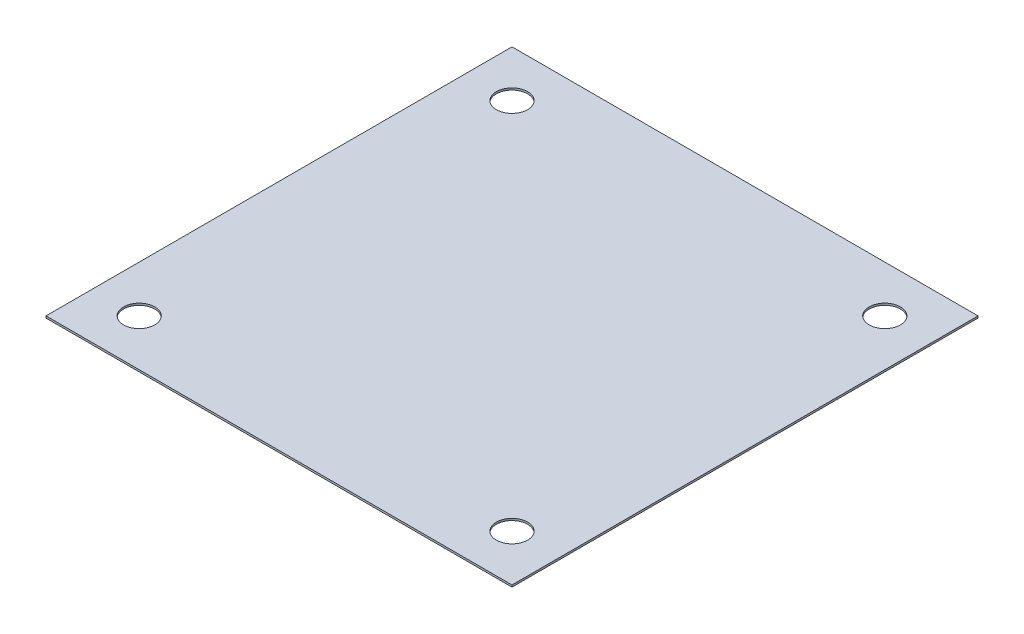
ISO-10303-21;
HEADER;
FILE_DESCRIPTION(('STEP AP214'),'2;1');
FILE_NAME('part.step','',(''),(''),'','','');
FILE_SCHEMA(('AUTOMOTIVE_DESIGN { 1 0 10303 214 1 1 1 1 }'));
ENDSEC;
DATA;
#1=APPLICATION_CONTEXT('core data for automotive mechanical design processes');
#2=APPLICATION_PROTOCOL_DEFINITION('international standard','automotive_design',2000,#1);
#3=PRODUCT_CONTEXT('',#1,'mechanical');
#4=PRODUCT('Part','Part','',(#3));
#5=PRODUCT_RELATED_PRODUCT_CATEGORY('part','',(#4));
#6=PRODUCT_DEFINITION_FORMATION('','',#4);
#7=PRODUCT_DEFINITION_CONTEXT('part definition',#1,'design');
#8=PRODUCT_DEFINITION('design','',#6,#7);
#9=PRODUCT_DEFINITION_SHAPE('','',#8);
#10=(LENGTH_UNIT() NAMED_UNIT(*) SI_UNIT(.MILLI.,.METRE.));
#11=(NAMED_UNIT(*) PLANE_ANGLE_UNIT() SI_UNIT($,.RADIAN.));
#12=(NAMED_UNIT(*) SI_UNIT($,.STERADIAN.) SOLID_ANGLE_UNIT());
#13=UNCERTAINTY_MEASURE_WITH_UNIT(LENGTH_MEASURE(1.E-05),#10,'distance_accuracy_value','');
#14=(GEOMETRIC_REPRESENTATION_CONTEXT(3) GLOBAL_UNCERTAINTY_ASSIGNED_CONTEXT((#13)) GLOBAL_UNIT_ASSIGNED_CONTEXT((#10,
#11,#12)) REPRESENTATION_CONTEXT('',''));
#15=CARTESIAN_POINT('',(0.,0.,0.));
#16=DIRECTION('',(0.,0.,1.));
#17=DIRECTION('',(1.,0.,0.));
#18=AXIS2_PLACEMENT_3D('',#15,#16,#17);
#19=CARTESIAN_POINT('',(-762.,6.35,-762.));
#20=DIRECTION('',(1.,0.,0.));
#21=DIRECTION('',(0.,0.,-1.));
#22=AXIS2_PLACEMENT_3D('',#19,#20,#21);
#23=PLANE('',#22);
#24=DIRECTION('',(0.,0.,1.));
#25=VECTOR('',#24,1.);
#26=CARTESIAN_POINT('',(-762.,0.,-762.));
#27=LINE('',#26,#25);
#28=CARTESIAN_POINT('',(-762.,0.,-762.));
#29=VERTEX_POINT('',#28);
#30=CARTESIAN_POINT('',(-762.,0.,762.));
#31=VERTEX_POINT('',#30);
#32=EDGE_CURVE('E98',#29,#31,#27,.T.);
#33=ORIENTED_EDGE('',*,*,#32,.T.);
#34=DIRECTION('',(0.,-1.,0.));
#35=VECTOR('',#34,1.);
#36=CARTESIAN_POINT('',(-762.,6.35,762.));
#37=LINE('',#36,#35);
#38=CARTESIAN_POINT('',(-762.,6.35,762.));
#39=VERTEX_POINT('',#38);
#40=EDGE_CURVE('E11',#39,#31,#37,.T.);
#41=ORIENTED_EDGE('',*,*,#40,.F.);
#42=DIRECTION('',(0.,0.,1.));
#43=VECTOR('',#42,1.);
#44=CARTESIAN_POINT('',(-762.,6.35,-762.));
#45=LINE('',#44,#43);
#46=CARTESIAN_POINT('',(-762.,6.35,-762.));
#47=VERTEX_POINT('',#46);
#48=EDGE_CURVE('E86',#47,#39,#45,.T.);
#49=ORIENTED_EDGE('',*,*,#48,.F.);
#50=DIRECTION('',(0.,-1.,0.));
#51=VECTOR('',#50,1.);
#52=CARTESIAN_POINT('',(-762.,6.35,-762.));
#53=LINE('',#52,#51);
#54=EDGE_CURVE('E94',#47,#29,#53,.T.);
#55=ORIENTED_EDGE('',*,*,#54,.T.);
#56=EDGE_LOOP('',(#33,#41,#49,#55));
#57=FACE_BOUND('',#56,.T.);
#58=ADVANCED_FACE('F35',(#57),#23,.F.);
#59=CARTESIAN_POINT('',(-762.,6.35,762.));
#60=DIRECTION('',(0.,0.,-1.));
#61=DIRECTION('',(-1.,0.,0.));
#62=AXIS2_PLACEMENT_3D('',#59,#60,#61);
#63=PLANE('',#62);
#64=DIRECTION('',(1.,0.,0.));
#65=VECTOR('',#64,1.);
#66=CARTESIAN_POINT('',(-762.,0.,762.));
#67=LINE('',#66,#65);
#68=CARTESIAN_POINT('',(762.,0.,762.));
#69=VERTEX_POINT('',#68);
#70=EDGE_CURVE('E90',#31,#69,#67,.T.);
#71=ORIENTED_EDGE('',*,*,#70,.T.);
#72=DIRECTION('',(0.,-1.,0.));
#73=VECTOR('',#72,1.);
#74=CARTESIAN_POINT('',(762.,6.35,762.));
#75=LINE('',#74,#73);
#76=CARTESIAN_POINT('',(762.,6.35,762.));
#77=VERTEX_POINT('',#76);
#78=EDGE_CURVE('E43',#77,#69,#75,.T.);
#79=ORIENTED_EDGE('',*,*,#78,.F.);
#80=DIRECTION('',(1.,0.,0.));
#81=VECTOR('',#80,1.);
#82=CARTESIAN_POINT('',(-762.,6.35,762.));
#83=LINE('',#82,#81);
#84=EDGE_CURVE('E81',#39,#77,#83,.T.);
#85=ORIENTED_EDGE('',*,*,#84,.F.);
#86=ORIENTED_EDGE('',*,*,#40,.T.);
#87=EDGE_LOOP('',(#71,#79,#85,#86));
#88=FACE_BOUND('',#87,.T.);
#89=ADVANCED_FACE('F89',(#88),#63,.F.);
#90=CARTESIAN_POINT('',(762.,6.35,-762.));
#91=DIRECTION('',(-1.,0.,0.));
#92=DIRECTION('',(0.,0.,1.));
#93=AXIS2_PLACEMENT_3D('',#90,#91,#92);
#94=PLANE('',#93);
#95=DIRECTION('',(0.,0.,-1.));
#96=VECTOR('',#95,1.);
#97=CARTESIAN_POINT('',(762.,0.,-762.));
#98=LINE('',#97,#96);
#99=CARTESIAN_POINT('',(762.,0.,-762.));
#100=VERTEX_POINT('',#99);
#101=EDGE_CURVE('E68',#69,#100,#98,.T.);
#102=ORIENTED_EDGE('',*,*,#101,.T.);
#103=DIRECTION('',(0.,-1.,0.));
#104=VECTOR('',#103,1.);
#105=CARTESIAN_POINT('',(762.,6.35,-762.));
#106=LINE('',#105,#104);
#107=CARTESIAN_POINT('',(762.,6.35,-762.));
#108=VERTEX_POINT('',#107);
#109=EDGE_CURVE('E91',#108,#100,#106,.T.);
#110=ORIENTED_EDGE('',*,*,#109,.F.);
#111=DIRECTION('',(0.,0.,-1.));
#112=VECTOR('',#111,1.);
#113=CARTESIAN_POINT('',(762.,6.35,-762.));
#114=LINE('',#113,#112);
#115=EDGE_CURVE('E84',#77,#108,#114,.T.);
#116=ORIENTED_EDGE('',*,*,#115,.F.);
#117=ORIENTED_EDGE('',*,*,#78,.T.);
#118=EDGE_LOOP('',(#102,#110,#116,#117));
#119=FACE_BOUND('',#118,.T.);
#120=ADVANCED_FACE('F92',(#119),#94,.F.);
#121=CARTESIAN_POINT('',(-762.,6.35,-762.));
#122=DIRECTION('',(0.,0.,1.));
#123=DIRECTION('',(1.,0.,0.));
#124=AXIS2_PLACEMENT_3D('',#121,#122,#123);
#125=PLANE('',#124);
#126=DIRECTION('',(-1.,0.,0.));
#127=VECTOR('',#126,1.);
#128=CARTESIAN_POINT('',(-762.,0.,-762.));
#129=LINE('',#128,#127);
#130=EDGE_CURVE('E74',#100,#29,#129,.T.);
#131=ORIENTED_EDGE('',*,*,#130,.T.);
#132=ORIENTED_EDGE('',*,*,#54,.F.);
#133=DIRECTION('',(-1.,0.,0.));
#134=VECTOR('',#133,1.);
#135=CARTESIAN_POINT('',(-762.,6.35,-762.));
#136=LINE('',#135,#134);
#137=EDGE_CURVE('E51',#108,#47,#136,.T.);
#138=ORIENTED_EDGE('',*,*,#137,.F.);
#139=ORIENTED_EDGE('',*,*,#109,.T.);
#140=EDGE_LOOP('',(#131,#132,#138,#139));
#141=FACE_BOUND('',#140,.T.);
#142=ADVANCED_FACE('F106',(#141),#125,.F.);
#143=CARTESIAN_POINT('',(-762.,6.35,762.));
#144=DIRECTION('',(0.,1.,0.));
#145=DIRECTION('',(0.,0.,1.));
#146=AXIS2_PLACEMENT_3D('',#143,#144,#145);
#147=PLANE('',#146);
#148=CARTESIAN_POINT('',(-609.6,6.35,-609.6));
#149=DIRECTION('',(0.,1.,0.));
#150=DIRECTION('',(0.,0.,1.));
#151=AXIS2_PLACEMENT_3D('',#148,#149,#150);
#152=CIRCLE('',#151,51.1302000000001);
#153=CARTESIAN_POINT('',(-609.6,6.35,-558.4698));
#154=VERTEX_POINT('',#153);
#155=EDGE_CURVE('E132',#154,#154,#152,.T.);
#156=ORIENTED_EDGE('',*,*,#155,.F.);
#157=EDGE_LOOP('',(#156));
#158=FACE_BOUND('',#157,.T.);
#159=CARTESIAN_POINT('',(-609.6,6.35,609.6));
#160=DIRECTION('',(0.,1.,0.));
#161=DIRECTION('',(0.,0.,1.));
#162=AXIS2_PLACEMENT_3D('',#159,#160,#161);
#163=CIRCLE('',#162,51.1302000000001);
#164=CARTESIAN_POINT('',(-609.6,6.35,660.7302));
#165=VERTEX_POINT('',#164);
#166=EDGE_CURVE('E126',#165,#165,#163,.T.);
#167=ORIENTED_EDGE('',*,*,#166,.F.);
#168=EDGE_LOOP('',(#167));
#169=FACE_BOUND('',#168,.T.);
#170=CARTESIAN_POINT('',(609.6,6.35,609.6));
#171=DIRECTION('',(0.,1.,0.));
#172=DIRECTION('',(0.,0.,1.));
#173=AXIS2_PLACEMENT_3D('',#170,#171,#172);
#174=CIRCLE('',#173,51.1302000000001);
#175=CARTESIAN_POINT('',(609.6,6.35,660.7302));
#176=VERTEX_POINT('',#175);
#177=EDGE_CURVE('E120',#176,#176,#174,.T.);
#178=ORIENTED_EDGE('',*,*,#177,.F.);
#179=EDGE_LOOP('',(#178));
#180=FACE_BOUND('',#179,.T.);
#181=CARTESIAN_POINT('',(609.6,6.35,-609.6));
#182=DIRECTION('',(0.,1.,0.));
#183=DIRECTION('',(0.,0.,1.));
#184=AXIS2_PLACEMENT_3D('',#181,#182,#183);
#185=CIRCLE('',#184,51.1302000000001);
#186=CARTESIAN_POINT('',(609.6,6.35,-558.4698));
#187=VERTEX_POINT('',#186);
#188=EDGE_CURVE('E114',#187,#187,#185,.T.);
#189=ORIENTED_EDGE('',*,*,#188,.F.);
#190=EDGE_LOOP('',(#189));
#191=FACE_BOUND('',#190,.T.);
#192=ORIENTED_EDGE('',*,*,#48,.T.);
#193=ORIENTED_EDGE('',*,*,#84,.T.);
#194=ORIENTED_EDGE('',*,*,#115,.T.);
#195=ORIENTED_EDGE('',*,*,#137,.T.);
#196=EDGE_LOOP('',(#192,#193,#194,#195));
#197=FACE_BOUND('',#196,.T.);
#198=ADVANCED_FACE('F82',(#158,#169,#180,#191,#197),#147,.T.);
#199=CARTESIAN_POINT('',(-762.,0.,762.));
#200=DIRECTION('',(0.,1.,0.));
#201=DIRECTION('',(0.,0.,1.));
#202=AXIS2_PLACEMENT_3D('',#199,#200,#201);
#203=PLANE('',#202);
#204=CARTESIAN_POINT('',(-609.6,0.,-609.6));
#205=DIRECTION('',(0.,1.,0.));
#206=DIRECTION('',(0.,0.,1.));
#207=AXIS2_PLACEMENT_3D('',#204,#205,#206);
#208=CIRCLE('',#207,51.1302000000001);
#209=CARTESIAN_POINT('',(-609.6,0.,-558.4698));
#210=VERTEX_POINT('',#209);
#211=EDGE_CURVE('E129',#210,#210,#208,.F.);
#212=ORIENTED_EDGE('',*,*,#211,.F.);
#213=EDGE_LOOP('',(#212));
#214=FACE_BOUND('',#213,.T.);
#215=CARTESIAN_POINT('',(-609.6,0.,609.6));
#216=DIRECTION('',(0.,1.,0.));
#217=DIRECTION('',(0.,0.,1.));
#218=AXIS2_PLACEMENT_3D('',#215,#216,#217);
#219=CIRCLE('',#218,51.1302000000001);
#220=CARTESIAN_POINT('',(-609.6,0.,660.7302));
#221=VERTEX_POINT('',#220);
#222=EDGE_CURVE('E123',#221,#221,#219,.F.);
#223=ORIENTED_EDGE('',*,*,#222,.F.);
#224=EDGE_LOOP('',(#223));
#225=FACE_BOUND('',#224,.T.);
#226=CARTESIAN_POINT('',(609.6,0.,609.6));
#227=DIRECTION('',(0.,1.,0.));
#228=DIRECTION('',(0.,0.,1.));
#229=AXIS2_PLACEMENT_3D('',#226,#227,#228);
#230=CIRCLE('',#229,51.1302000000001);
#231=CARTESIAN_POINT('',(609.6,0.,660.7302));
#232=VERTEX_POINT('',#231);
#233=EDGE_CURVE('E117',#232,#232,#230,.F.);
#234=ORIENTED_EDGE('',*,*,#233,.F.);
#235=EDGE_LOOP('',(#234));
#236=FACE_BOUND('',#235,.T.);
#237=CARTESIAN_POINT('',(609.6,0.,-609.6));
#238=DIRECTION('',(0.,1.,0.));
#239=DIRECTION('',(0.,0.,1.));
#240=AXIS2_PLACEMENT_3D('',#237,#238,#239);
#241=CIRCLE('',#240,51.1302000000001);
#242=CARTESIAN_POINT('',(609.6,0.,-558.4698));
#243=VERTEX_POINT('',#242);
#244=EDGE_CURVE('E101',#243,#243,#241,.F.);
#245=ORIENTED_EDGE('',*,*,#244,.F.);
#246=EDGE_LOOP('',(#245));
#247=FACE_BOUND('',#246,.T.);
#248=ORIENTED_EDGE('',*,*,#32,.F.);
#249=ORIENTED_EDGE('',*,*,#130,.F.);
#250=ORIENTED_EDGE('',*,*,#101,.F.);
#251=ORIENTED_EDGE('',*,*,#70,.F.);
#252=EDGE_LOOP('',(#248,#249,#250,#251));
#253=FACE_BOUND('',#252,.T.);
#254=ADVANCED_FACE('F109',(#214,#225,#236,#247,#253),#203,.F.);
#255=CARTESIAN_POINT('',(609.6,-0.00100000000000013,-609.6));
#256=DIRECTION('',(0.,1.,0.));
#257=DIRECTION('',(0.,0.,1.));
#258=AXIS2_PLACEMENT_3D('',#255,#256,#257);
#259=CYLINDRICAL_SURFACE('',#258,51.1302000000001);
#260=ORIENTED_EDGE('',*,*,#188,.T.);
#261=EDGE_LOOP('',(#260));
#262=FACE_BOUND('',#261,.T.);
#263=ORIENTED_EDGE('',*,*,#244,.T.);
#264=EDGE_LOOP('',(#263));
#265=FACE_BOUND('',#264,.T.);
#266=ADVANCED_FACE('F148',(#262,#265),#259,.F.);
#267=CARTESIAN_POINT('',(609.6,-0.00100000000000013,609.6));
#268=DIRECTION('',(0.,1.,0.));
#269=DIRECTION('',(0.,0.,1.));
#270=AXIS2_PLACEMENT_3D('',#267,#268,#269);
#271=CYLINDRICAL_SURFACE('',#270,51.1302000000001);
#272=ORIENTED_EDGE('',*,*,#177,.T.);
#273=EDGE_LOOP('',(#272));
#274=FACE_BOUND('',#273,.T.);
#275=ORIENTED_EDGE('',*,*,#233,.T.);
#276=EDGE_LOOP('',(#275));
#277=FACE_BOUND('',#276,.T.);
#278=ADVANCED_FACE('F151',(#274,#277),#271,.F.);
#279=CARTESIAN_POINT('',(-609.6,-0.00100000000000013,609.6));
#280=DIRECTION('',(0.,1.,0.));
#281=DIRECTION('',(0.,0.,1.));
#282=AXIS2_PLACEMENT_3D('',#279,#280,#281);
#283=CYLINDRICAL_SURFACE('',#282,51.1302000000001);
#284=ORIENTED_EDGE('',*,*,#166,.T.);
#285=EDGE_LOOP('',(#284));
#286=FACE_BOUND('',#285,.T.);
#287=ORIENTED_EDGE('',*,*,#222,.T.);
#288=EDGE_LOOP('',(#287));
#289=FACE_BOUND('',#288,.T.);
#290=ADVANCED_FACE('F198',(#286,#289),#283,.F.);
#291=CARTESIAN_POINT('',(-609.6,-0.00100000000000013,-609.6));
#292=DIRECTION('',(0.,1.,0.));
#293=DIRECTION('',(0.,0.,1.));
#294=AXIS2_PLACEMENT_3D('',#291,#292,#293);
#295=CYLINDRICAL_SURFACE('',#294,51.1302000000001);
#296=ORIENTED_EDGE('',*,*,#155,.T.);
#297=EDGE_LOOP('',(#296));
#298=FACE_BOUND('',#297,.T.);
#299=ORIENTED_EDGE('',*,*,#211,.T.);
#300=EDGE_LOOP('',(#299));
#301=FACE_BOUND('',#300,.T.);
#302=ADVANCED_FACE('F136',(#298,#301),#295,.F.);
#303=CLOSED_SHELL('',(#58,#89,#120,#142,#198,#254,#266,#278,#290,#302));
#304=MANIFOLD_SOLID_BREP('B2',#303);
#305=ADVANCED_BREP_SHAPE_REPRESENTATION('',(#18,#304),#14);
#306=SHAPE_DEFINITION_REPRESENTATION(#9,#305);
ENDSEC;
END-ISO-10303-21;
